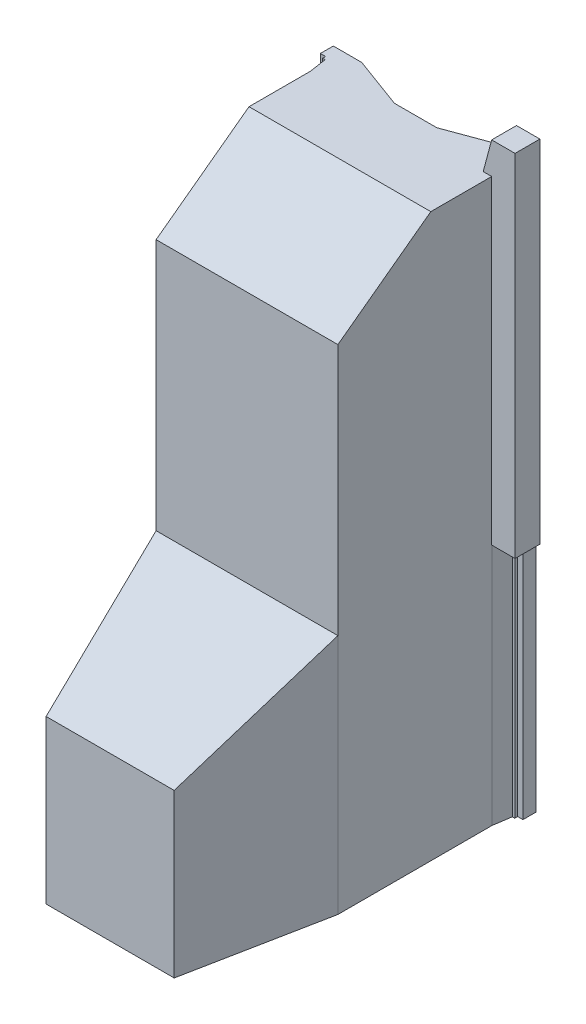
ISO-10303-21;
HEADER;
FILE_DESCRIPTION(('STEP AP214'),'2;1');
FILE_NAME('part.step','',(''),(''),'','','');
FILE_SCHEMA(('AUTOMOTIVE_DESIGN { 1 0 10303 214 1 1 1 1 }'));
ENDSEC;
DATA;
#1=APPLICATION_CONTEXT('core data for automotive mechanical design processes');
#2=APPLICATION_PROTOCOL_DEFINITION('international standard','automotive_design',2000,#1);
#3=PRODUCT_CONTEXT('',#1,'mechanical');
#4=PRODUCT('Part','Part','',(#3));
#5=PRODUCT_RELATED_PRODUCT_CATEGORY('part','',(#4));
#6=PRODUCT_DEFINITION_FORMATION('','',#4);
#7=PRODUCT_DEFINITION_CONTEXT('part definition',#1,'design');
#8=PRODUCT_DEFINITION('design','',#6,#7);
#9=PRODUCT_DEFINITION_SHAPE('','',#8);
#10=(LENGTH_UNIT() NAMED_UNIT(*) SI_UNIT(.MILLI.,.METRE.));
#11=(NAMED_UNIT(*) PLANE_ANGLE_UNIT() SI_UNIT($,.RADIAN.));
#12=(NAMED_UNIT(*) SI_UNIT($,.STERADIAN.) SOLID_ANGLE_UNIT());
#13=UNCERTAINTY_MEASURE_WITH_UNIT(LENGTH_MEASURE(1.E-05),#10,'distance_accuracy_value','');
#14=(GEOMETRIC_REPRESENTATION_CONTEXT(3) GLOBAL_UNCERTAINTY_ASSIGNED_CONTEXT((#13)) GLOBAL_UNIT_ASSIGNED_CONTEXT((#10,
#11,#12)) REPRESENTATION_CONTEXT('',''));
#15=CARTESIAN_POINT('',(0.,0.,0.));
#16=DIRECTION('',(0.,0.,1.));
#17=DIRECTION('',(1.,0.,0.));
#18=AXIS2_PLACEMENT_3D('',#15,#16,#17);
#19=CARTESIAN_POINT('',(122.,215.9978213353,1792.5));
#20=DIRECTION('',(1.,0.,0.));
#21=DIRECTION('',(0.,0.,1.));
#22=AXIS2_PLACEMENT_3D('',#19,#20,#21);
#23=PLANE('',#22);
#24=DIRECTION('',(0.,0.,1.));
#25=VECTOR('',#24,1.);
#26=CARTESIAN_POINT('',(122.,823.,1501.5));
#27=LINE('',#26,#25);
#28=CARTESIAN_POINT('',(122.,823.,1501.5));
#29=VERTEX_POINT('',#28);
#30=CARTESIAN_POINT('',(122.,823.,1616.7054502456));
#31=VERTEX_POINT('',#30);
#32=EDGE_CURVE('E11',#29,#31,#27,.T.);
#33=ORIENTED_EDGE('',*,*,#32,.T.);
#34=DIRECTION('',(0.,-0.59458300067059,0.804034237650087));
#35=VECTOR('',#34,1.);
#36=CARTESIAN_POINT('',(122.,823.,1616.7054502456));
#37=LINE('',#36,#35);
#38=CARTESIAN_POINT('',(122.,693.,1792.5));
#39=VERTEX_POINT('',#38);
#40=EDGE_CURVE('E27',#31,#39,#37,.T.);
#41=ORIENTED_EDGE('',*,*,#40,.T.);
#42=DIRECTION('',(0.,-1.,0.));
#43=VECTOR('',#42,1.);
#44=CARTESIAN_POINT('',(122.,693.,1792.5));
#45=LINE('',#44,#43);
#46=CARTESIAN_POINT('',(122.,215.9978213353,1792.5));
#47=VERTEX_POINT('',#46);
#48=EDGE_CURVE('E333',#39,#47,#45,.T.);
#49=ORIENTED_EDGE('',*,*,#48,.T.);
#50=DIRECTION('',(0.,1.,0.));
#51=VECTOR('',#50,1.);
#52=CARTESIAN_POINT('',(122.,-241.,1792.5));
#53=LINE('',#52,#51);
#54=CARTESIAN_POINT('',(122.,-241.,1792.5));
#55=VERTEX_POINT('',#54);
#56=EDGE_CURVE('E344',#55,#47,#53,.T.);
#57=ORIENTED_EDGE('',*,*,#56,.F.);
#58=DIRECTION('',(0.,0.,-1.));
#59=VECTOR('',#58,1.);
#60=CARTESIAN_POINT('',(122.,-241.,1792.5));
#61=LINE('',#60,#59);
#62=CARTESIAN_POINT('',(122.,-241.,1500.5));
#63=VERTEX_POINT('',#62);
#64=EDGE_CURVE('E249',#55,#63,#61,.T.);
#65=ORIENTED_EDGE('',*,*,#64,.T.);
#66=DIRECTION('',(0.,1.,0.));
#67=VECTOR('',#66,1.);
#68=CARTESIAN_POINT('',(122.,-241.,1500.5));
#69=LINE('',#68,#67);
#70=CARTESIAN_POINT('',(122.,219.,1500.5));
#71=VERTEX_POINT('',#70);
#72=EDGE_CURVE('E246',#63,#71,#69,.T.);
#73=ORIENTED_EDGE('',*,*,#72,.T.);
#74=DIRECTION('',(0.,0.,1.));
#75=VECTOR('',#74,1.);
#76=CARTESIAN_POINT('',(122.,219.,1500.5));
#77=LINE('',#76,#75);
#78=CARTESIAN_POINT('',(122.,219.,1501.5));
#79=VERTEX_POINT('',#78);
#80=EDGE_CURVE('E250',#71,#79,#77,.T.);
#81=ORIENTED_EDGE('',*,*,#80,.T.);
#82=DIRECTION('',(0.,-1.,0.));
#83=VECTOR('',#82,1.);
#84=CARTESIAN_POINT('',(122.,823.,1501.5));
#85=LINE('',#84,#83);
#86=EDGE_CURVE('E284',#29,#79,#85,.T.);
#87=ORIENTED_EDGE('',*,*,#86,.F.);
#88=EDGE_LOOP('',(#33,#41,#49,#57,#65,#73,#81,#87));
#89=FACE_BOUND('',#88,.T.);
#90=ADVANCED_FACE('F17',(#89),#23,.T.);
#91=CARTESIAN_POINT('',(122.,883.,1501.5));
#92=DIRECTION('',(0.,0.,1.));
#93=DIRECTION('',(1.,0.,0.));
#94=AXIS2_PLACEMENT_3D('',#91,#92,#93);
#95=PLANE('',#94);
#96=DIRECTION('',(1.,0.,0.));
#97=VECTOR('',#96,1.);
#98=CARTESIAN_POINT('',(122.,219.,1501.5));
#99=LINE('',#98,#97);
#100=CARTESIAN_POINT('',(166.25,219.,1501.5));
#101=VERTEX_POINT('',#100);
#102=EDGE_CURVE('E362',#79,#101,#99,.T.);
#103=ORIENTED_EDGE('',*,*,#102,.T.);
#104=DIRECTION('',(0.,1.,0.));
#105=VECTOR('',#104,1.);
#106=CARTESIAN_POINT('',(166.25,219.,1501.5));
#107=LINE('',#106,#105);
#108=CARTESIAN_POINT('',(166.25,883.,1501.5));
#109=VERTEX_POINT('',#108);
#110=EDGE_CURVE('E55',#101,#109,#107,.T.);
#111=ORIENTED_EDGE('',*,*,#110,.T.);
#112=DIRECTION('',(-1.,0.,0.));
#113=VECTOR('',#112,1.);
#114=CARTESIAN_POINT('',(166.25,883.,1501.5));
#115=LINE('',#114,#113);
#116=CARTESIAN_POINT('',(122.,883.,1501.5));
#117=VERTEX_POINT('',#116);
#118=EDGE_CURVE('E67',#109,#117,#115,.T.);
#119=ORIENTED_EDGE('',*,*,#118,.T.);
#120=DIRECTION('',(-0.257662650560314,-0.966234939601251,0.));
#121=VECTOR('',#120,1.);
#122=CARTESIAN_POINT('',(122.,883.,1501.5));
#123=LINE('',#122,#121);
#124=CARTESIAN_POINT('',(106.,823.,1501.5));
#125=VERTEX_POINT('',#124);
#126=EDGE_CURVE('E286',#117,#125,#123,.T.);
#127=ORIENTED_EDGE('',*,*,#126,.T.);
#128=DIRECTION('',(-1.,0.,0.));
#129=VECTOR('',#128,1.);
#130=CARTESIAN_POINT('',(122.,823.,1501.5));
#131=LINE('',#130,#129);
#132=EDGE_CURVE('E306',#29,#125,#131,.T.);
#133=ORIENTED_EDGE('',*,*,#132,.F.);
#134=ORIENTED_EDGE('',*,*,#86,.T.);
#135=EDGE_LOOP('',(#103,#111,#119,#127,#133,#134));
#136=FACE_BOUND('',#135,.T.);
#137=ADVANCED_FACE('F451',(#136),#95,.T.);
#138=CARTESIAN_POINT('',(122.,823.,1437.5));
#139=DIRECTION('',(0.,1.,0.));
#140=DIRECTION('',(0.,0.,-1.));
#141=AXIS2_PLACEMENT_3D('',#138,#139,#140);
#142=PLANE('',#141);
#143=DIRECTION('',(0.,0.,1.));
#144=VECTOR('',#143,1.);
#145=CARTESIAN_POINT('',(106.,823.,1454.5));
#146=LINE('',#145,#144);
#147=CARTESIAN_POINT('',(106.,823.,1454.5));
#148=VERTEX_POINT('',#147);
#149=EDGE_CURVE('E275',#148,#125,#146,.T.);
#150=ORIENTED_EDGE('',*,*,#149,.F.);
#151=DIRECTION('',(-1.,0.,0.));
#152=VECTOR('',#151,1.);
#153=CARTESIAN_POINT('',(141.7,823.,1454.5));
#154=LINE('',#153,#152);
#155=CARTESIAN_POINT('',(141.7,823.,1454.5));
#156=VERTEX_POINT('',#155);
#157=EDGE_CURVE('E323',#156,#148,#154,.T.);
#158=ORIENTED_EDGE('',*,*,#157,.F.);
#159=DIRECTION('',(0.,0.,-1.));
#160=VECTOR('',#159,1.);
#161=CARTESIAN_POINT('',(141.7,823.,1454.5));
#162=LINE('',#161,#160);
#163=CARTESIAN_POINT('',(141.7,823.,1437.5));
#164=VERTEX_POINT('',#163);
#165=EDGE_CURVE('E287',#156,#164,#162,.T.);
#166=ORIENTED_EDGE('',*,*,#165,.T.);
#167=DIRECTION('',(-1.,0.,0.));
#168=VECTOR('',#167,1.);
#169=CARTESIAN_POINT('',(141.7,823.,1437.5));
#170=LINE('',#169,#168);
#171=CARTESIAN_POINT('',(88.,823.,1437.5));
#172=VERTEX_POINT('',#171);
#173=EDGE_CURVE('E316',#164,#172,#170,.T.);
#174=ORIENTED_EDGE('',*,*,#173,.T.);
#175=DIRECTION('',(0.93866975951673,0.,-0.344817462679611));
#176=VECTOR('',#175,1.);
#177=CARTESIAN_POINT('',(-10.,823.,1473.5));
#178=LINE('',#177,#176);
#179=CARTESIAN_POINT('',(-10.,823.,1473.5));
#180=VERTEX_POINT('',#179);
#181=EDGE_CURVE('E312',#180,#172,#178,.T.);
#182=ORIENTED_EDGE('',*,*,#181,.F.);
#183=DIRECTION('',(1.,0.,0.));
#184=VECTOR('',#183,1.);
#185=CARTESIAN_POINT('',(-90.,823.,1473.5));
#186=LINE('',#185,#184);
#187=CARTESIAN_POINT('',(-90.,823.,1473.5));
#188=VERTEX_POINT('',#187);
#189=EDGE_CURVE('E349',#188,#180,#186,.T.);
#190=ORIENTED_EDGE('',*,*,#189,.F.);
#191=DIRECTION('',(0.93866975951673,0.,0.344817462679611));
#192=VECTOR('',#191,1.);
#193=CARTESIAN_POINT('',(-188.,823.,1437.5));
#194=LINE('',#193,#192);
#195=CARTESIAN_POINT('',(-188.,823.,1437.5));
#196=VERTEX_POINT('',#195);
#197=EDGE_CURVE('E359',#196,#188,#194,.T.);
#198=ORIENTED_EDGE('',*,*,#197,.F.);
#199=DIRECTION('',(-1.,0.,0.));
#200=VECTOR('',#199,1.);
#201=CARTESIAN_POINT('',(-188.,823.,1437.5));
#202=LINE('',#201,#200);
#203=CARTESIAN_POINT('',(-241.7,823.,1437.5));
#204=VERTEX_POINT('',#203);
#205=EDGE_CURVE('E313',#196,#204,#202,.T.);
#206=ORIENTED_EDGE('',*,*,#205,.T.);
#207=DIRECTION('',(0.,0.,1.));
#208=VECTOR('',#207,1.);
#209=CARTESIAN_POINT('',(-241.7,823.,1437.5));
#210=LINE('',#209,#208);
#211=CARTESIAN_POINT('',(-241.7,823.,1462.));
#212=VERTEX_POINT('',#211);
#213=EDGE_CURVE('E254',#204,#212,#210,.T.);
#214=ORIENTED_EDGE('',*,*,#213,.T.);
#215=DIRECTION('',(1.,0.,0.));
#216=VECTOR('',#215,1.);
#217=CARTESIAN_POINT('',(-241.7,823.,1462.));
#218=LINE('',#217,#216);
#219=CARTESIAN_POINT('',(-231.7,823.,1462.));
#220=VERTEX_POINT('',#219);
#221=EDGE_CURVE('E251',#212,#220,#218,.T.);
#222=ORIENTED_EDGE('',*,*,#221,.T.);
#223=DIRECTION('',(0.,0.,1.));
#224=VECTOR('',#223,1.);
#225=CARTESIAN_POINT('',(-231.7,823.,1462.));
#226=LINE('',#225,#224);
#227=CARTESIAN_POINT('',(-231.7,823.,1467.5));
#228=VERTEX_POINT('',#227);
#229=EDGE_CURVE('E244',#220,#228,#226,.T.);
#230=ORIENTED_EDGE('',*,*,#229,.T.);
#231=DIRECTION('',(1.,0.,0.));
#232=VECTOR('',#231,1.);
#233=CARTESIAN_POINT('',(-231.7,823.,1467.5));
#234=LINE('',#233,#232);
#235=CARTESIAN_POINT('',(-227.,823.,1467.5));
#236=VERTEX_POINT('',#235);
#237=EDGE_CURVE('E241',#228,#236,#234,.T.);
#238=ORIENTED_EDGE('',*,*,#237,.T.);
#239=DIRECTION('',(0.149805379427995,0.,0.988715504224767));
#240=VECTOR('',#239,1.);
#241=CARTESIAN_POINT('',(-227.,823.,1467.5));
#242=LINE('',#241,#240);
#243=CARTESIAN_POINT('',(-222.,823.,1500.5));
#244=VERTEX_POINT('',#243);
#245=EDGE_CURVE('E245',#236,#244,#242,.T.);
#246=ORIENTED_EDGE('',*,*,#245,.T.);
#247=DIRECTION('',(0.,0.,1.));
#248=VECTOR('',#247,1.);
#249=CARTESIAN_POINT('',(-222.,823.,1500.5));
#250=LINE('',#249,#248);
#251=CARTESIAN_POINT('',(-222.,823.,1616.7054502456));
#252=VERTEX_POINT('',#251);
#253=EDGE_CURVE('E308',#244,#252,#250,.T.);
#254=ORIENTED_EDGE('',*,*,#253,.T.);
#255=DIRECTION('',(-1.,0.,0.));
#256=VECTOR('',#255,1.);
#257=CARTESIAN_POINT('',(122.,823.,1616.7054502456));
#258=LINE('',#257,#256);
#259=EDGE_CURVE('E309',#31,#252,#258,.T.);
#260=ORIENTED_EDGE('',*,*,#259,.F.);
#261=ORIENTED_EDGE('',*,*,#32,.F.);
#262=ORIENTED_EDGE('',*,*,#132,.T.);
#263=EDGE_LOOP('',(#150,#158,#166,#174,#182,#190,#198,#206,#214,#222,#230,#238,#246,#254,#260,
#261,#262));
#264=FACE_BOUND('',#263,.T.);
#265=ADVANCED_FACE('F457',(#264),#142,.T.);
#266=CARTESIAN_POINT('',(122.,823.,1616.7054502456));
#267=DIRECTION('',(0.,0.804034237650087,0.59458300067059));
#268=DIRECTION('',(-1.,0.,0.));
#269=AXIS2_PLACEMENT_3D('',#266,#267,#268);
#270=PLANE('',#269);
#271=ORIENTED_EDGE('',*,*,#259,.T.);
#272=DIRECTION('',(0.,-0.59458300067059,0.804034237650087));
#273=VECTOR('',#272,1.);
#274=CARTESIAN_POINT('',(-222.,823.,1616.7054502456));
#275=LINE('',#274,#273);
#276=CARTESIAN_POINT('',(-222.,693.,1792.5));
#277=VERTEX_POINT('',#276);
#278=EDGE_CURVE('E262',#252,#277,#275,.T.);
#279=ORIENTED_EDGE('',*,*,#278,.T.);
#280=DIRECTION('',(-1.,0.,0.));
#281=VECTOR('',#280,1.);
#282=CARTESIAN_POINT('',(122.,693.,1792.5));
#283=LINE('',#282,#281);
#284=EDGE_CURVE('E260',#39,#277,#283,.T.);
#285=ORIENTED_EDGE('',*,*,#284,.F.);
#286=ORIENTED_EDGE('',*,*,#40,.F.);
#287=EDGE_LOOP('',(#271,#279,#285,#286));
#288=FACE_BOUND('',#287,.T.);
#289=ADVANCED_FACE('F475',(#288),#270,.T.);
#290=CARTESIAN_POINT('',(122.,693.,1792.5));
#291=DIRECTION('',(0.,0.,1.));
#292=DIRECTION('',(1.,0.,0.));
#293=AXIS2_PLACEMENT_3D('',#290,#291,#292);
#294=PLANE('',#293);
#295=ORIENTED_EDGE('',*,*,#284,.T.);
#296=DIRECTION('',(0.,-1.,0.));
#297=VECTOR('',#296,1.);
#298=CARTESIAN_POINT('',(-222.,693.,1792.5));
#299=LINE('',#298,#297);
#300=CARTESIAN_POINT('',(-222.,215.9978213353,1792.5));
#301=VERTEX_POINT('',#300);
#302=EDGE_CURVE('E263',#277,#301,#299,.T.);
#303=ORIENTED_EDGE('',*,*,#302,.T.);
#304=DIRECTION('',(-1.,0.,0.));
#305=VECTOR('',#304,1.);
#306=CARTESIAN_POINT('',(122.,215.9978213353,1792.5));
#307=LINE('',#306,#305);
#308=EDGE_CURVE('E318',#47,#301,#307,.T.);
#309=ORIENTED_EDGE('',*,*,#308,.F.);
#310=ORIENTED_EDGE('',*,*,#48,.F.);
#311=EDGE_LOOP('',(#295,#303,#309,#310));
#312=FACE_BOUND('',#311,.T.);
#313=ADVANCED_FACE('F478',(#312),#294,.T.);
#314=CARTESIAN_POINT('',(122.,215.9978213353,1792.5));
#315=DIRECTION('',(0.,0.866025403784429,0.500000000000017));
#316=DIRECTION('',(-1.,0.,0.));
#317=AXIS2_PLACEMENT_3D('',#314,#315,#316);
#318=PLANE('',#317);
#319=ORIENTED_EDGE('',*,*,#308,.T.);
#320=DIRECTION('',(0.167535186445604,-0.49293304852251,0.853785084770718));
#321=VECTOR('',#320,1.);
#322=CARTESIAN_POINT('',(-222.,215.9978213353,1792.5));
#323=LINE('',#322,#321);
#324=CARTESIAN_POINT('',(-171.1773584906,66.4641016151002,2051.5));
#325=VERTEX_POINT('',#324);
#326=EDGE_CURVE('E228',#301,#325,#323,.T.);
#327=ORIENTED_EDGE('',*,*,#326,.T.);
#328=DIRECTION('',(-1.,0.,0.));
#329=VECTOR('',#328,1.);
#330=CARTESIAN_POINT('',(71.1773584906,66.4641016151002,2051.5));
#331=LINE('',#330,#329);
#332=CARTESIAN_POINT('',(71.1773584906,66.4641016151002,2051.5));
#333=VERTEX_POINT('',#332);
#334=EDGE_CURVE('E216',#333,#325,#331,.T.);
#335=ORIENTED_EDGE('',*,*,#334,.F.);
#336=DIRECTION('',(-0.167535186445604,-0.49293304852251,0.853785084770718));
#337=VECTOR('',#336,1.);
#338=CARTESIAN_POINT('',(122.,215.9978213353,1792.5));
#339=LINE('',#338,#337);
#340=EDGE_CURVE('E346',#47,#333,#339,.T.);
#341=ORIENTED_EDGE('',*,*,#340,.F.);
#342=EDGE_LOOP('',(#319,#327,#335,#341));
#343=FACE_BOUND('',#342,.T.);
#344=ADVANCED_FACE('F432',(#343),#318,.T.);
#345=CARTESIAN_POINT('',(71.1773584906,-241.,2051.5));
#346=DIRECTION('',(-0.981286320481883,0.,-0.192554296849297));
#347=DIRECTION('',(-0.192554296849297,0.,0.981286320481883));
#348=AXIS2_PLACEMENT_3D('',#345,#346,#347);
#349=PLANE('',#348);
#350=DIRECTION('',(0.,-1.,0.));
#351=VECTOR('',#350,1.);
#352=CARTESIAN_POINT('',(71.1773584906,66.4641016151002,2051.5));
#353=LINE('',#352,#351);
#354=CARTESIAN_POINT('',(71.1773584906,-241.,2051.5));
#355=VERTEX_POINT('',#354);
#356=EDGE_CURVE('E276',#333,#355,#353,.T.);
#357=ORIENTED_EDGE('',*,*,#356,.T.);
#358=DIRECTION('',(0.192554296849297,0.,-0.981286320481883));
#359=VECTOR('',#358,1.);
#360=CARTESIAN_POINT('',(71.1773584906,-241.,2051.5));
#361=LINE('',#360,#359);
#362=EDGE_CURVE('E279',#355,#55,#361,.T.);
#363=ORIENTED_EDGE('',*,*,#362,.T.);
#364=ORIENTED_EDGE('',*,*,#56,.T.);
#365=ORIENTED_EDGE('',*,*,#340,.T.);
#366=EDGE_LOOP('',(#357,#363,#364,#365));
#367=FACE_BOUND('',#366,.T.);
#368=ADVANCED_FACE('F436',(#367),#349,.F.);
#369=CARTESIAN_POINT('',(122.,-241.,2051.5));
#370=DIRECTION('',(0.,-1.,0.));
#371=DIRECTION('',(1.,0.,0.));
#372=AXIS2_PLACEMENT_3D('',#369,#370,#371);
#373=PLANE('',#372);
#374=DIRECTION('',(1.,0.,0.));
#375=VECTOR('',#374,1.);
#376=CARTESIAN_POINT('',(-160.7777777778,-241.,1447.5));
#377=LINE('',#376,#375);
#378=CARTESIAN_POINT('',(-160.7777777778,-241.,1447.5));
#379=VERTEX_POINT('',#378);
#380=CARTESIAN_POINT('',(60.7777777778,-241.,1447.5));
#381=VERTEX_POINT('',#380);
#382=EDGE_CURVE('E366',#379,#381,#377,.T.);
#383=ORIENTED_EDGE('',*,*,#382,.T.);
#384=DIRECTION('',(0.93866975951673,0.,-0.344817462679611));
#385=VECTOR('',#384,1.);
#386=CARTESIAN_POINT('',(60.7777777778,-241.,1447.5));
#387=LINE('',#386,#385);
#388=CARTESIAN_POINT('',(88.,-241.,1437.5));
#389=VERTEX_POINT('',#388);
#390=EDGE_CURVE('E368',#381,#389,#387,.T.);
#391=ORIENTED_EDGE('',*,*,#390,.T.);
#392=DIRECTION('',(1.,0.,0.));
#393=VECTOR('',#392,1.);
#394=CARTESIAN_POINT('',(88.,-241.,1437.5));
#395=LINE('',#394,#393);
#396=CARTESIAN_POINT('',(141.7,-241.,1437.5));
#397=VERTEX_POINT('',#396);
#398=EDGE_CURVE('E354',#389,#397,#395,.T.);
#399=ORIENTED_EDGE('',*,*,#398,.T.);
#400=DIRECTION('',(0.,0.,-1.));
#401=VECTOR('',#400,1.);
#402=CARTESIAN_POINT('',(141.7,-241.,1462.));
#403=LINE('',#402,#401);
#404=CARTESIAN_POINT('',(141.7,-241.,1462.));
#405=VERTEX_POINT('',#404);
#406=EDGE_CURVE('E334',#405,#397,#403,.T.);
#407=ORIENTED_EDGE('',*,*,#406,.F.);
#408=DIRECTION('',(1.,0.,0.));
#409=VECTOR('',#408,1.);
#410=CARTESIAN_POINT('',(131.7,-241.,1462.));
#411=LINE('',#410,#409);
#412=CARTESIAN_POINT('',(131.7,-241.,1462.));
#413=VERTEX_POINT('',#412);
#414=EDGE_CURVE('E337',#413,#405,#411,.T.);
#415=ORIENTED_EDGE('',*,*,#414,.F.);
#416=DIRECTION('',(0.,0.,-1.));
#417=VECTOR('',#416,1.);
#418=CARTESIAN_POINT('',(131.7,-241.,1467.5));
#419=LINE('',#418,#417);
#420=CARTESIAN_POINT('',(131.7,-241.,1467.5));
#421=VERTEX_POINT('',#420);
#422=EDGE_CURVE('E291',#421,#413,#419,.T.);
#423=ORIENTED_EDGE('',*,*,#422,.F.);
#424=DIRECTION('',(1.,0.,0.));
#425=VECTOR('',#424,1.);
#426=CARTESIAN_POINT('',(127.,-241.,1467.5));
#427=LINE('',#426,#425);
#428=CARTESIAN_POINT('',(127.,-241.,1467.5));
#429=VERTEX_POINT('',#428);
#430=EDGE_CURVE('E365',#429,#421,#427,.T.);
#431=ORIENTED_EDGE('',*,*,#430,.F.);
#432=DIRECTION('',(0.149805379427995,0.,-0.988715504224767));
#433=VECTOR('',#432,1.);
#434=CARTESIAN_POINT('',(122.,-241.,1500.5));
#435=LINE('',#434,#433);
#436=EDGE_CURVE('E363',#63,#429,#435,.T.);
#437=ORIENTED_EDGE('',*,*,#436,.F.);
#438=ORIENTED_EDGE('',*,*,#64,.F.);
#439=ORIENTED_EDGE('',*,*,#362,.F.);
#440=DIRECTION('',(-1.,0.,0.));
#441=VECTOR('',#440,1.);
#442=CARTESIAN_POINT('',(71.1773584906,-241.,2051.5));
#443=LINE('',#442,#441);
#444=CARTESIAN_POINT('',(-171.1773584906,-241.,2051.5));
#445=VERTEX_POINT('',#444);
#446=EDGE_CURVE('E210',#355,#445,#443,.T.);
#447=ORIENTED_EDGE('',*,*,#446,.T.);
#448=DIRECTION('',(0.192554296849297,0.,0.981286320481883));
#449=VECTOR('',#448,1.);
#450=CARTESIAN_POINT('',(-222.,-241.,1792.5));
#451=LINE('',#450,#449);
#452=CARTESIAN_POINT('',(-222.,-241.,1792.5));
#453=VERTEX_POINT('',#452);
#454=EDGE_CURVE('E203',#453,#445,#451,.T.);
#455=ORIENTED_EDGE('',*,*,#454,.F.);
#456=DIRECTION('',(0.,0.,-1.));
#457=VECTOR('',#456,1.);
#458=CARTESIAN_POINT('',(-222.,-241.,1792.5));
#459=LINE('',#458,#457);
#460=CARTESIAN_POINT('',(-222.,-241.,1500.5));
#461=VERTEX_POINT('',#460);
#462=EDGE_CURVE('E207',#453,#461,#459,.T.);
#463=ORIENTED_EDGE('',*,*,#462,.T.);
#464=DIRECTION('',(0.149805379427995,0.,0.988715504224767));
#465=VECTOR('',#464,1.);
#466=CARTESIAN_POINT('',(-227.,-241.,1467.5));
#467=LINE('',#466,#465);
#468=CARTESIAN_POINT('',(-227.,-241.,1467.5));
#469=VERTEX_POINT('',#468);
#470=EDGE_CURVE('E231',#469,#461,#467,.T.);
#471=ORIENTED_EDGE('',*,*,#470,.F.);
#472=DIRECTION('',(1.,0.,0.));
#473=VECTOR('',#472,1.);
#474=CARTESIAN_POINT('',(-231.7,-241.,1467.5));
#475=LINE('',#474,#473);
#476=CARTESIAN_POINT('',(-231.7,-241.,1467.5));
#477=VERTEX_POINT('',#476);
#478=EDGE_CURVE('E303',#477,#469,#475,.T.);
#479=ORIENTED_EDGE('',*,*,#478,.F.);
#480=DIRECTION('',(0.,0.,1.));
#481=VECTOR('',#480,1.);
#482=CARTESIAN_POINT('',(-231.7,-241.,1462.));
#483=LINE('',#482,#481);
#484=CARTESIAN_POINT('',(-231.7,-241.,1462.));
#485=VERTEX_POINT('',#484);
#486=EDGE_CURVE('E296',#485,#477,#483,.T.);
#487=ORIENTED_EDGE('',*,*,#486,.F.);
#488=DIRECTION('',(1.,0.,0.));
#489=VECTOR('',#488,1.);
#490=CARTESIAN_POINT('',(-241.7,-241.,1462.));
#491=LINE('',#490,#489);
#492=CARTESIAN_POINT('',(-241.7,-241.,1462.));
#493=VERTEX_POINT('',#492);
#494=EDGE_CURVE('E371',#493,#485,#491,.T.);
#495=ORIENTED_EDGE('',*,*,#494,.F.);
#496=DIRECTION('',(0.,0.,1.));
#497=VECTOR('',#496,1.);
#498=CARTESIAN_POINT('',(-241.7,-241.,1437.5));
#499=LINE('',#498,#497);
#500=CARTESIAN_POINT('',(-241.7,-241.,1437.5));
#501=VERTEX_POINT('',#500);
#502=EDGE_CURVE('E378',#501,#493,#499,.T.);
#503=ORIENTED_EDGE('',*,*,#502,.F.);
#504=DIRECTION('',(1.,0.,0.));
#505=VECTOR('',#504,1.);
#506=CARTESIAN_POINT('',(-241.7,-241.,1437.5));
#507=LINE('',#506,#505);
#508=CARTESIAN_POINT('',(-188.,-241.,1437.5));
#509=VERTEX_POINT('',#508);
#510=EDGE_CURVE('E224',#501,#509,#507,.T.);
#511=ORIENTED_EDGE('',*,*,#510,.T.);
#512=DIRECTION('',(0.93866975951673,0.,0.344817462679611));
#513=VECTOR('',#512,1.);
#514=CARTESIAN_POINT('',(-188.,-241.,1437.5));
#515=LINE('',#514,#513);
#516=EDGE_CURVE('E351',#509,#379,#515,.T.);
#517=ORIENTED_EDGE('',*,*,#516,.T.);
#518=EDGE_LOOP('',(#383,#391,#399,#407,#415,#423,#431,#437,#438,#439,#447,#455,#463,#471,#479,
#487,#495,#503,#511,#517));
#519=FACE_BOUND('',#518,.T.);
#520=ADVANCED_FACE('F206',(#519),#373,.T.);
#521=CARTESIAN_POINT('',(-188.,823.,1437.5));
#522=DIRECTION('',(-0.344817462679611,0.,0.93866975951673));
#523=DIRECTION('',(0.,-1.,0.));
#524=AXIS2_PLACEMENT_3D('',#521,#522,#523);
#525=PLANE('',#524);
#526=ORIENTED_EDGE('',*,*,#197,.T.);
#527=DIRECTION('',(0.,-1.,0.));
#528=VECTOR('',#527,1.);
#529=CARTESIAN_POINT('',(-90.,823.,1473.5));
#530=LINE('',#529,#528);
#531=CARTESIAN_POINT('',(-90.,559.,1473.5));
#532=VERTEX_POINT('',#531);
#533=EDGE_CURVE('E235',#188,#532,#530,.T.);
#534=ORIENTED_EDGE('',*,*,#533,.T.);
#535=DIRECTION('',(0.93866975951673,0.,0.344817462679611));
#536=VECTOR('',#535,1.);
#537=CARTESIAN_POINT('',(-160.7777777778,559.,1447.5));
#538=LINE('',#537,#536);
#539=CARTESIAN_POINT('',(-160.7777777778,559.,1447.5));
#540=VERTEX_POINT('',#539);
#541=EDGE_CURVE('E267',#540,#532,#538,.T.);
#542=ORIENTED_EDGE('',*,*,#541,.F.);
#543=DIRECTION('',(0.,-1.,0.));
#544=VECTOR('',#543,1.);
#545=CARTESIAN_POINT('',(-160.7777777778,559.,1447.5));
#546=LINE('',#545,#544);
#547=EDGE_CURVE('E258',#540,#379,#546,.T.);
#548=ORIENTED_EDGE('',*,*,#547,.T.);
#549=ORIENTED_EDGE('',*,*,#516,.F.);
#550=DIRECTION('',(0.,-1.,0.));
#551=VECTOR('',#550,1.);
#552=CARTESIAN_POINT('',(-188.,823.,1437.5));
#553=LINE('',#552,#551);
#554=EDGE_CURVE('E255',#196,#509,#553,.T.);
#555=ORIENTED_EDGE('',*,*,#554,.F.);
#556=EDGE_LOOP('',(#526,#534,#542,#548,#549,#555));
#557=FACE_BOUND('',#556,.T.);
#558=ADVANCED_FACE('F417',(#557),#525,.F.);
#559=CARTESIAN_POINT('',(122.,-241.,1437.5));
#560=DIRECTION('',(0.,0.,-1.));
#561=DIRECTION('',(0.,1.,0.));
#562=AXIS2_PLACEMENT_3D('',#559,#560,#561);
#563=PLANE('',#562);
#564=ORIENTED_EDGE('',*,*,#510,.F.);
#565=DIRECTION('',(0.,-1.,0.));
#566=VECTOR('',#565,1.);
#567=CARTESIAN_POINT('',(-241.7,823.,1437.5));
#568=LINE('',#567,#566);
#569=EDGE_CURVE('E375',#204,#501,#568,.T.);
#570=ORIENTED_EDGE('',*,*,#569,.F.);
#571=ORIENTED_EDGE('',*,*,#205,.F.);
#572=ORIENTED_EDGE('',*,*,#554,.T.);
#573=EDGE_LOOP('',(#564,#570,#571,#572));
#574=FACE_BOUND('',#573,.T.);
#575=ADVANCED_FACE('F518',(#574),#563,.T.);
#576=CARTESIAN_POINT('',(122.,-241.,1437.5));
#577=DIRECTION('',(0.,0.,-1.));
#578=DIRECTION('',(0.,1.,0.));
#579=AXIS2_PLACEMENT_3D('',#576,#577,#578);
#580=PLANE('',#579);
#581=ORIENTED_EDGE('',*,*,#173,.F.);
#582=DIRECTION('',(0.,-1.,0.));
#583=VECTOR('',#582,1.);
#584=CARTESIAN_POINT('',(141.7,823.,1437.5));
#585=LINE('',#584,#583);
#586=EDGE_CURVE('E259',#164,#397,#585,.T.);
#587=ORIENTED_EDGE('',*,*,#586,.T.);
#588=ORIENTED_EDGE('',*,*,#398,.F.);
#589=DIRECTION('',(0.,1.,0.));
#590=VECTOR('',#589,1.);
#591=CARTESIAN_POINT('',(88.,-241.,1437.5));
#592=LINE('',#591,#590);
#593=EDGE_CURVE('E374',#389,#172,#592,.T.);
#594=ORIENTED_EDGE('',*,*,#593,.T.);
#595=EDGE_LOOP('',(#581,#587,#588,#594));
#596=FACE_BOUND('',#595,.T.);
#597=ADVANCED_FACE('F516',(#596),#580,.T.);
#598=CARTESIAN_POINT('',(-241.7,823.,1437.5));
#599=DIRECTION('',(-1.,0.,0.));
#600=DIRECTION('',(0.,-1.,0.));
#601=AXIS2_PLACEMENT_3D('',#598,#599,#600);
#602=PLANE('',#601);
#603=ORIENTED_EDGE('',*,*,#569,.T.);
#604=ORIENTED_EDGE('',*,*,#502,.T.);
#605=DIRECTION('',(0.,-1.,0.));
#606=VECTOR('',#605,1.);
#607=CARTESIAN_POINT('',(-241.7,823.,1462.));
#608=LINE('',#607,#606);
#609=EDGE_CURVE('E552',#212,#493,#608,.T.);
#610=ORIENTED_EDGE('',*,*,#609,.F.);
#611=ORIENTED_EDGE('',*,*,#213,.F.);
#612=EDGE_LOOP('',(#603,#604,#610,#611));
#613=FACE_BOUND('',#612,.T.);
#614=ADVANCED_FACE('F462',(#613),#602,.T.);
#615=CARTESIAN_POINT('',(-241.7,823.,1462.));
#616=DIRECTION('',(0.,0.,1.));
#617=DIRECTION('',(1.,0.,0.));
#618=AXIS2_PLACEMENT_3D('',#615,#616,#617);
#619=PLANE('',#618);
#620=ORIENTED_EDGE('',*,*,#609,.T.);
#621=ORIENTED_EDGE('',*,*,#494,.T.);
#622=DIRECTION('',(0.,-1.,0.));
#623=VECTOR('',#622,1.);
#624=CARTESIAN_POINT('',(-231.7,823.,1462.));
#625=LINE('',#624,#623);
#626=EDGE_CURVE('E299',#220,#485,#625,.T.);
#627=ORIENTED_EDGE('',*,*,#626,.F.);
#628=ORIENTED_EDGE('',*,*,#221,.F.);
#629=EDGE_LOOP('',(#620,#621,#627,#628));
#630=FACE_BOUND('',#629,.T.);
#631=ADVANCED_FACE('F582',(#630),#619,.T.);
#632=CARTESIAN_POINT('',(-231.7,823.,1462.));
#633=DIRECTION('',(-1.,0.,0.));
#634=DIRECTION('',(0.,-1.,0.));
#635=AXIS2_PLACEMENT_3D('',#632,#633,#634);
#636=PLANE('',#635);
#637=ORIENTED_EDGE('',*,*,#626,.T.);
#638=ORIENTED_EDGE('',*,*,#486,.T.);
#639=DIRECTION('',(0.,-1.,0.));
#640=VECTOR('',#639,1.);
#641=CARTESIAN_POINT('',(-231.7,823.,1467.5));
#642=LINE('',#641,#640);
#643=EDGE_CURVE('E300',#228,#477,#642,.T.);
#644=ORIENTED_EDGE('',*,*,#643,.F.);
#645=ORIENTED_EDGE('',*,*,#229,.F.);
#646=EDGE_LOOP('',(#637,#638,#644,#645));
#647=FACE_BOUND('',#646,.T.);
#648=ADVANCED_FACE('F509',(#647),#636,.T.);
#649=CARTESIAN_POINT('',(-231.7,823.,1467.5));
#650=DIRECTION('',(0.,0.,1.));
#651=DIRECTION('',(1.,0.,0.));
#652=AXIS2_PLACEMENT_3D('',#649,#650,#651);
#653=PLANE('',#652);
#654=ORIENTED_EDGE('',*,*,#643,.T.);
#655=ORIENTED_EDGE('',*,*,#478,.T.);
#656=DIRECTION('',(0.,-1.,0.));
#657=VECTOR('',#656,1.);
#658=CARTESIAN_POINT('',(-227.,823.,1467.5));
#659=LINE('',#658,#657);
#660=EDGE_CURVE('E391',#236,#469,#659,.T.);
#661=ORIENTED_EDGE('',*,*,#660,.F.);
#662=ORIENTED_EDGE('',*,*,#237,.F.);
#663=EDGE_LOOP('',(#654,#655,#661,#662));
#664=FACE_BOUND('',#663,.T.);
#665=ADVANCED_FACE('F503',(#664),#653,.T.);
#666=CARTESIAN_POINT('',(-227.,823.,1467.5));
#667=DIRECTION('',(-0.988715504224767,0.,0.149805379427995));
#668=DIRECTION('',(0.,-1.,0.));
#669=AXIS2_PLACEMENT_3D('',#666,#667,#668);
#670=PLANE('',#669);
#671=ORIENTED_EDGE('',*,*,#245,.F.);
#672=ORIENTED_EDGE('',*,*,#660,.T.);
#673=ORIENTED_EDGE('',*,*,#470,.T.);
#674=DIRECTION('',(0.,1.,0.));
#675=VECTOR('',#674,1.);
#676=CARTESIAN_POINT('',(-222.,-241.,1500.5));
#677=LINE('',#676,#675);
#678=EDGE_CURVE('E223',#461,#244,#677,.T.);
#679=ORIENTED_EDGE('',*,*,#678,.T.);
#680=EDGE_LOOP('',(#671,#672,#673,#679));
#681=FACE_BOUND('',#680,.T.);
#682=ADVANCED_FACE('F499',(#681),#670,.T.);
#683=CARTESIAN_POINT('',(-222.,215.9978213353,1792.5));
#684=DIRECTION('',(1.,0.,0.));
#685=DIRECTION('',(0.,0.,1.));
#686=AXIS2_PLACEMENT_3D('',#683,#684,#685);
#687=PLANE('',#686);
#688=ORIENTED_EDGE('',*,*,#462,.F.);
#689=DIRECTION('',(0.,1.,0.));
#690=VECTOR('',#689,1.);
#691=CARTESIAN_POINT('',(-222.,-241.,1792.5));
#692=LINE('',#691,#690);
#693=EDGE_CURVE('E215',#453,#301,#692,.T.);
#694=ORIENTED_EDGE('',*,*,#693,.T.);
#695=ORIENTED_EDGE('',*,*,#302,.F.);
#696=ORIENTED_EDGE('',*,*,#278,.F.);
#697=ORIENTED_EDGE('',*,*,#253,.F.);
#698=ORIENTED_EDGE('',*,*,#678,.F.);
#699=EDGE_LOOP('',(#688,#694,#695,#696,#697,#698));
#700=FACE_BOUND('',#699,.T.);
#701=ADVANCED_FACE('F220',(#700),#687,.F.);
#702=CARTESIAN_POINT('',(-222.,-241.,1792.5));
#703=DIRECTION('',(0.981286320481883,0.,-0.192554296849297));
#704=DIRECTION('',(0.,1.,0.));
#705=AXIS2_PLACEMENT_3D('',#702,#703,#704);
#706=PLANE('',#705);
#707=ORIENTED_EDGE('',*,*,#693,.F.);
#708=ORIENTED_EDGE('',*,*,#454,.T.);
#709=DIRECTION('',(0.,-1.,0.));
#710=VECTOR('',#709,1.);
#711=CARTESIAN_POINT('',(-171.1773584906,66.4641016151002,2051.5));
#712=LINE('',#711,#710);
#713=EDGE_CURVE('E290',#325,#445,#712,.T.);
#714=ORIENTED_EDGE('',*,*,#713,.F.);
#715=ORIENTED_EDGE('',*,*,#326,.F.);
#716=EDGE_LOOP('',(#707,#708,#714,#715));
#717=FACE_BOUND('',#716,.T.);
#718=ADVANCED_FACE('F226',(#717),#706,.F.);
#719=CARTESIAN_POINT('',(122.,66.4641016151002,2051.5));
#720=DIRECTION('',(0.,0.,1.));
#721=DIRECTION('',(1.,0.,0.));
#722=AXIS2_PLACEMENT_3D('',#719,#720,#721);
#723=PLANE('',#722);
#724=ORIENTED_EDGE('',*,*,#334,.T.);
#725=ORIENTED_EDGE('',*,*,#713,.T.);
#726=ORIENTED_EDGE('',*,*,#446,.F.);
#727=ORIENTED_EDGE('',*,*,#356,.F.);
#728=EDGE_LOOP('',(#724,#725,#726,#727));
#729=FACE_BOUND('',#728,.T.);
#730=ADVANCED_FACE('F439',(#729),#723,.T.);
#731=CARTESIAN_POINT('',(-10.,823.,1473.5));
#732=DIRECTION('',(0.344817462679611,0.,0.93866975951673));
#733=DIRECTION('',(0.,1.,0.));
#734=AXIS2_PLACEMENT_3D('',#731,#732,#733);
#735=PLANE('',#734);
#736=DIRECTION('',(0.,-1.,0.));
#737=VECTOR('',#736,1.);
#738=CARTESIAN_POINT('',(-10.,823.,1473.5));
#739=LINE('',#738,#737);
#740=CARTESIAN_POINT('',(-10.,559.,1473.5));
#741=VERTEX_POINT('',#740);
#742=EDGE_CURVE('E347',#180,#741,#739,.T.);
#743=ORIENTED_EDGE('',*,*,#742,.F.);
#744=ORIENTED_EDGE('',*,*,#181,.T.);
#745=ORIENTED_EDGE('',*,*,#593,.F.);
#746=ORIENTED_EDGE('',*,*,#390,.F.);
#747=DIRECTION('',(0.,-1.,0.));
#748=VECTOR('',#747,1.);
#749=CARTESIAN_POINT('',(60.7777777778,559.,1447.5));
#750=LINE('',#749,#748);
#751=CARTESIAN_POINT('',(60.7777777778,559.,1447.5));
#752=VERTEX_POINT('',#751);
#753=EDGE_CURVE('E283',#752,#381,#750,.T.);
#754=ORIENTED_EDGE('',*,*,#753,.F.);
#755=DIRECTION('',(0.93866975951673,0.,-0.344817462679611));
#756=VECTOR('',#755,1.);
#757=CARTESIAN_POINT('',(-10.,559.,1473.5));
#758=LINE('',#757,#756);
#759=EDGE_CURVE('E268',#741,#752,#758,.T.);
#760=ORIENTED_EDGE('',*,*,#759,.F.);
#761=EDGE_LOOP('',(#743,#744,#745,#746,#754,#760));
#762=FACE_BOUND('',#761,.T.);
#763=ADVANCED_FACE('F441',(#762),#735,.F.);
#764=CARTESIAN_POINT('',(-50.,559.,1441.5));
#765=DIRECTION('',(0.,1.,0.));
#766=DIRECTION('',(0.,0.,-1.));
#767=AXIS2_PLACEMENT_3D('',#764,#765,#766);
#768=PLANE('',#767);
#769=ORIENTED_EDGE('',*,*,#541,.T.);
#770=DIRECTION('',(1.,0.,0.));
#771=VECTOR('',#770,1.);
#772=CARTESIAN_POINT('',(-90.,559.,1473.5));
#773=LINE('',#772,#771);
#774=EDGE_CURVE('E264',#532,#741,#773,.T.);
#775=ORIENTED_EDGE('',*,*,#774,.T.);
#776=ORIENTED_EDGE('',*,*,#759,.T.);
#777=DIRECTION('',(1.,0.,0.));
#778=VECTOR('',#777,1.);
#779=CARTESIAN_POINT('',(-160.7777777778,559.,1447.5));
#780=LINE('',#779,#778);
#781=EDGE_CURVE('E280',#540,#752,#780,.T.);
#782=ORIENTED_EDGE('',*,*,#781,.F.);
#783=EDGE_LOOP('',(#769,#775,#776,#782));
#784=FACE_BOUND('',#783,.T.);
#785=ADVANCED_FACE('F403',(#784),#768,.T.);
#786=CARTESIAN_POINT('',(-160.7777777778,559.,1447.5));
#787=DIRECTION('',(0.,0.,1.));
#788=DIRECTION('',(1.,0.,0.));
#789=AXIS2_PLACEMENT_3D('',#786,#787,#788);
#790=PLANE('',#789);
#791=ORIENTED_EDGE('',*,*,#547,.F.);
#792=ORIENTED_EDGE('',*,*,#781,.T.);
#793=ORIENTED_EDGE('',*,*,#753,.T.);
#794=ORIENTED_EDGE('',*,*,#382,.F.);
#795=EDGE_LOOP('',(#791,#792,#793,#794));
#796=FACE_BOUND('',#795,.T.);
#797=ADVANCED_FACE('F412',(#796),#790,.F.);
#798=CARTESIAN_POINT('',(-90.,823.,1473.5));
#799=DIRECTION('',(0.,0.,1.));
#800=DIRECTION('',(1.,0.,0.));
#801=AXIS2_PLACEMENT_3D('',#798,#799,#800);
#802=PLANE('',#801);
#803=ORIENTED_EDGE('',*,*,#742,.T.);
#804=ORIENTED_EDGE('',*,*,#774,.F.);
#805=ORIENTED_EDGE('',*,*,#533,.F.);
#806=ORIENTED_EDGE('',*,*,#189,.T.);
#807=EDGE_LOOP('',(#803,#804,#805,#806));
#808=FACE_BOUND('',#807,.T.);
#809=ADVANCED_FACE('F483',(#808),#802,.F.);
#810=CARTESIAN_POINT('',(141.7,823.,1462.));
#811=DIRECTION('',(1.,0.,0.));
#812=DIRECTION('',(0.,0.,1.));
#813=AXIS2_PLACEMENT_3D('',#810,#811,#812);
#814=PLANE('',#813);
#815=DIRECTION('',(0.,0.,-1.));
#816=VECTOR('',#815,1.);
#817=CARTESIAN_POINT('',(141.7,219.,1462.));
#818=LINE('',#817,#816);
#819=CARTESIAN_POINT('',(141.7,219.,1462.));
#820=VERTEX_POINT('',#819);
#821=CARTESIAN_POINT('',(141.7,219.,1454.5));
#822=VERTEX_POINT('',#821);
#823=EDGE_CURVE('E240',#820,#822,#818,.T.);
#824=ORIENTED_EDGE('',*,*,#823,.F.);
#825=DIRECTION('',(0.,-1.,0.));
#826=VECTOR('',#825,1.);
#827=CARTESIAN_POINT('',(141.7,219.,1462.));
#828=LINE('',#827,#826);
#829=EDGE_CURVE('E336',#820,#405,#828,.T.);
#830=ORIENTED_EDGE('',*,*,#829,.T.);
#831=ORIENTED_EDGE('',*,*,#406,.T.);
#832=ORIENTED_EDGE('',*,*,#586,.F.);
#833=ORIENTED_EDGE('',*,*,#165,.F.);
#834=DIRECTION('',(0.,-1.,0.));
#835=VECTOR('',#834,1.);
#836=CARTESIAN_POINT('',(141.7,823.,1454.5));
#837=LINE('',#836,#835);
#838=EDGE_CURVE('E327',#156,#822,#837,.T.);
#839=ORIENTED_EDGE('',*,*,#838,.T.);
#840=EDGE_LOOP('',(#824,#830,#831,#832,#833,#839));
#841=FACE_BOUND('',#840,.T.);
#842=ADVANCED_FACE('F486',(#841),#814,.T.);
#843=CARTESIAN_POINT('',(131.7,823.,1454.5));
#844=DIRECTION('',(0.,0.,-1.));
#845=DIRECTION('',(0.,1.,0.));
#846=AXIS2_PLACEMENT_3D('',#843,#844,#845);
#847=PLANE('',#846);
#848=DIRECTION('',(-0.257662650560314,-0.966234939601251,0.));
#849=VECTOR('',#848,1.);
#850=CARTESIAN_POINT('',(122.,883.,1454.5));
#851=LINE('',#850,#849);
#852=CARTESIAN_POINT('',(122.,883.,1454.5));
#853=VERTEX_POINT('',#852);
#854=EDGE_CURVE('E271',#853,#148,#851,.T.);
#855=ORIENTED_EDGE('',*,*,#854,.F.);
#856=DIRECTION('',(-1.,0.,0.));
#857=VECTOR('',#856,1.);
#858=CARTESIAN_POINT('',(166.25,883.,1454.5));
#859=LINE('',#858,#857);
#860=CARTESIAN_POINT('',(166.25,883.,1454.5));
#861=VERTEX_POINT('',#860);
#862=EDGE_CURVE('E125',#861,#853,#859,.T.);
#863=ORIENTED_EDGE('',*,*,#862,.F.);
#864=DIRECTION('',(0.,1.,0.));
#865=VECTOR('',#864,1.);
#866=CARTESIAN_POINT('',(166.25,219.,1454.5));
#867=LINE('',#866,#865);
#868=CARTESIAN_POINT('',(166.25,219.,1454.5));
#869=VERTEX_POINT('',#868);
#870=EDGE_CURVE('E130',#869,#861,#867,.T.);
#871=ORIENTED_EDGE('',*,*,#870,.F.);
#872=DIRECTION('',(1.,0.,0.));
#873=VECTOR('',#872,1.);
#874=CARTESIAN_POINT('',(141.7,219.,1454.5));
#875=LINE('',#874,#873);
#876=EDGE_CURVE('E270',#822,#869,#875,.T.);
#877=ORIENTED_EDGE('',*,*,#876,.F.);
#878=ORIENTED_EDGE('',*,*,#838,.F.);
#879=ORIENTED_EDGE('',*,*,#157,.T.);
#880=EDGE_LOOP('',(#855,#863,#871,#877,#878,#879));
#881=FACE_BOUND('',#880,.T.);
#882=ADVANCED_FACE('F473',(#881),#847,.T.);
#883=CARTESIAN_POINT('',(122.,219.,1501.5));
#884=DIRECTION('',(0.,-1.,0.));
#885=DIRECTION('',(1.,0.,0.));
#886=AXIS2_PLACEMENT_3D('',#883,#884,#885);
#887=PLANE('',#886);
#888=DIRECTION('',(0.149805379427995,0.,-0.988715504224767));
#889=VECTOR('',#888,1.);
#890=CARTESIAN_POINT('',(122.,219.,1500.5));
#891=LINE('',#890,#889);
#892=CARTESIAN_POINT('',(127.,219.,1467.5));
#893=VERTEX_POINT('',#892);
#894=EDGE_CURVE('E320',#71,#893,#891,.T.);
#895=ORIENTED_EDGE('',*,*,#894,.T.);
#896=DIRECTION('',(1.,0.,0.));
#897=VECTOR('',#896,1.);
#898=CARTESIAN_POINT('',(127.,219.,1467.5));
#899=LINE('',#898,#897);
#900=CARTESIAN_POINT('',(131.7,219.,1467.5));
#901=VERTEX_POINT('',#900);
#902=EDGE_CURVE('E324',#893,#901,#899,.T.);
#903=ORIENTED_EDGE('',*,*,#902,.T.);
#904=DIRECTION('',(0.,0.,-1.));
#905=VECTOR('',#904,1.);
#906=CARTESIAN_POINT('',(131.7,219.,1467.5));
#907=LINE('',#906,#905);
#908=CARTESIAN_POINT('',(131.7,219.,1462.));
#909=VERTEX_POINT('',#908);
#910=EDGE_CURVE('E21',#901,#909,#907,.T.);
#911=ORIENTED_EDGE('',*,*,#910,.T.);
#912=DIRECTION('',(1.,0.,0.));
#913=VECTOR('',#912,1.);
#914=CARTESIAN_POINT('',(131.7,219.,1462.));
#915=LINE('',#914,#913);
#916=EDGE_CURVE('E237',#909,#820,#915,.T.);
#917=ORIENTED_EDGE('',*,*,#916,.T.);
#918=ORIENTED_EDGE('',*,*,#823,.T.);
#919=ORIENTED_EDGE('',*,*,#876,.T.);
#920=DIRECTION('',(0.,0.,-1.));
#921=VECTOR('',#920,1.);
#922=CARTESIAN_POINT('',(166.25,219.,1501.5));
#923=LINE('',#922,#921);
#924=EDGE_CURVE('E563',#101,#869,#923,.T.);
#925=ORIENTED_EDGE('',*,*,#924,.F.);
#926=ORIENTED_EDGE('',*,*,#102,.F.);
#927=ORIENTED_EDGE('',*,*,#80,.F.);
#928=EDGE_LOOP('',(#895,#903,#911,#917,#918,#919,#925,#926,#927));
#929=FACE_BOUND('',#928,.T.);
#930=ADVANCED_FACE('F470',(#929),#887,.T.);
#931=CARTESIAN_POINT('',(166.25,219.,1501.5));
#932=DIRECTION('',(1.,0.,0.));
#933=DIRECTION('',(0.,0.,1.));
#934=AXIS2_PLACEMENT_3D('',#931,#932,#933);
#935=PLANE('',#934);
#936=ORIENTED_EDGE('',*,*,#924,.T.);
#937=ORIENTED_EDGE('',*,*,#870,.T.);
#938=DIRECTION('',(0.,0.,-1.));
#939=VECTOR('',#938,1.);
#940=CARTESIAN_POINT('',(166.25,883.,1501.5));
#941=LINE('',#940,#939);
#942=EDGE_CURVE('E330',#109,#861,#941,.T.);
#943=ORIENTED_EDGE('',*,*,#942,.F.);
#944=ORIENTED_EDGE('',*,*,#110,.F.);
#945=EDGE_LOOP('',(#936,#937,#943,#944));
#946=FACE_BOUND('',#945,.T.);
#947=ADVANCED_FACE('F19',(#946),#935,.T.);
#948=CARTESIAN_POINT('',(166.25,883.,1501.5));
#949=DIRECTION('',(0.,1.,0.));
#950=DIRECTION('',(0.,0.,-1.));
#951=AXIS2_PLACEMENT_3D('',#948,#949,#950);
#952=PLANE('',#951);
#953=ORIENTED_EDGE('',*,*,#942,.T.);
#954=ORIENTED_EDGE('',*,*,#862,.T.);
#955=DIRECTION('',(0.,0.,-1.));
#956=VECTOR('',#955,1.);
#957=CARTESIAN_POINT('',(122.,883.,1501.5));
#958=LINE('',#957,#956);
#959=EDGE_CURVE('E274',#117,#853,#958,.T.);
#960=ORIENTED_EDGE('',*,*,#959,.F.);
#961=ORIENTED_EDGE('',*,*,#118,.F.);
#962=EDGE_LOOP('',(#953,#954,#960,#961));
#963=FACE_BOUND('',#962,.T.);
#964=ADVANCED_FACE('F496',(#963),#952,.T.);
#965=CARTESIAN_POINT('',(122.,883.,1501.5));
#966=DIRECTION('',(-0.966234939601251,0.257662650560314,0.));
#967=DIRECTION('',(-0.257662650560314,-0.966234939601251,0.));
#968=AXIS2_PLACEMENT_3D('',#965,#966,#967);
#969=PLANE('',#968);
#970=ORIENTED_EDGE('',*,*,#126,.F.);
#971=ORIENTED_EDGE('',*,*,#959,.T.);
#972=ORIENTED_EDGE('',*,*,#854,.T.);
#973=ORIENTED_EDGE('',*,*,#149,.T.);
#974=EDGE_LOOP('',(#970,#971,#972,#973));
#975=FACE_BOUND('',#974,.T.);
#976=ADVANCED_FACE('F492',(#975),#969,.T.);
#977=CARTESIAN_POINT('',(131.7,823.,1462.));
#978=DIRECTION('',(0.,0.,1.));
#979=DIRECTION('',(1.,0.,0.));
#980=AXIS2_PLACEMENT_3D('',#977,#978,#979);
#981=PLANE('',#980);
#982=DIRECTION('',(0.,-1.,0.));
#983=VECTOR('',#982,1.);
#984=CARTESIAN_POINT('',(131.7,219.,1462.));
#985=LINE('',#984,#983);
#986=EDGE_CURVE('E339',#909,#413,#985,.T.);
#987=ORIENTED_EDGE('',*,*,#986,.T.);
#988=ORIENTED_EDGE('',*,*,#414,.T.);
#989=ORIENTED_EDGE('',*,*,#829,.F.);
#990=ORIENTED_EDGE('',*,*,#916,.F.);
#991=EDGE_LOOP('',(#987,#988,#989,#990));
#992=FACE_BOUND('',#991,.T.);
#993=ADVANCED_FACE('F468',(#992),#981,.T.);
#994=CARTESIAN_POINT('',(131.7,823.,1467.5));
#995=DIRECTION('',(1.,0.,0.));
#996=DIRECTION('',(0.,0.,1.));
#997=AXIS2_PLACEMENT_3D('',#994,#995,#996);
#998=PLANE('',#997);
#999=DIRECTION('',(0.,-1.,0.));
#1000=VECTOR('',#999,1.);
#1001=CARTESIAN_POINT('',(131.7,219.,1467.5));
#1002=LINE('',#1001,#1000);
#1003=EDGE_CURVE('E294',#901,#421,#1002,.T.);
#1004=ORIENTED_EDGE('',*,*,#1003,.T.);
#1005=ORIENTED_EDGE('',*,*,#422,.T.);
#1006=ORIENTED_EDGE('',*,*,#986,.F.);
#1007=ORIENTED_EDGE('',*,*,#910,.F.);
#1008=EDGE_LOOP('',(#1004,#1005,#1006,#1007));
#1009=FACE_BOUND('',#1008,.T.);
#1010=ADVANCED_FACE('F464',(#1009),#998,.T.);
#1011=CARTESIAN_POINT('',(127.,823.,1467.5));
#1012=DIRECTION('',(0.,0.,1.));
#1013=DIRECTION('',(1.,0.,0.));
#1014=AXIS2_PLACEMENT_3D('',#1011,#1012,#1013);
#1015=PLANE('',#1014);
#1016=DIRECTION('',(0.,-1.,0.));
#1017=VECTOR('',#1016,1.);
#1018=CARTESIAN_POINT('',(127.,219.,1467.5));
#1019=LINE('',#1018,#1017);
#1020=EDGE_CURVE('E295',#893,#429,#1019,.T.);
#1021=ORIENTED_EDGE('',*,*,#1020,.T.);
#1022=ORIENTED_EDGE('',*,*,#430,.T.);
#1023=ORIENTED_EDGE('',*,*,#1003,.F.);
#1024=ORIENTED_EDGE('',*,*,#902,.F.);
#1025=EDGE_LOOP('',(#1021,#1022,#1023,#1024));
#1026=FACE_BOUND('',#1025,.T.);
#1027=ADVANCED_FACE('F467',(#1026),#1015,.T.);
#1028=CARTESIAN_POINT('',(122.,823.,1500.5));
#1029=DIRECTION('',(0.988715504224767,0.,0.149805379427995));
#1030=DIRECTION('',(0.,1.,0.));
#1031=AXIS2_PLACEMENT_3D('',#1028,#1029,#1030);
#1032=PLANE('',#1031);
#1033=ORIENTED_EDGE('',*,*,#72,.F.);
#1034=ORIENTED_EDGE('',*,*,#436,.T.);
#1035=ORIENTED_EDGE('',*,*,#1020,.F.);
#1036=ORIENTED_EDGE('',*,*,#894,.F.);
#1037=EDGE_LOOP('',(#1033,#1034,#1035,#1036));
#1038=FACE_BOUND('',#1037,.T.);
#1039=ADVANCED_FACE('F624',(#1038),#1032,.T.);
#1040=CLOSED_SHELL('',(#90,#137,#265,#289,#313,#344,#368,#520,#558,#575,#597,#614,#631,#648,
#665,#682,#701,#718,#730,#763,#785,#797,#809,#842,#882,#930,#947,#964,#976,#993,#1010,#1027,#1039));
#1041=MANIFOLD_SOLID_BREP('B1',#1040);
#1042=ADVANCED_BREP_SHAPE_REPRESENTATION('',(#18,#1041),#14);
#1043=SHAPE_DEFINITION_REPRESENTATION(#9,#1042);
ENDSEC;
END-ISO-10303-21;
